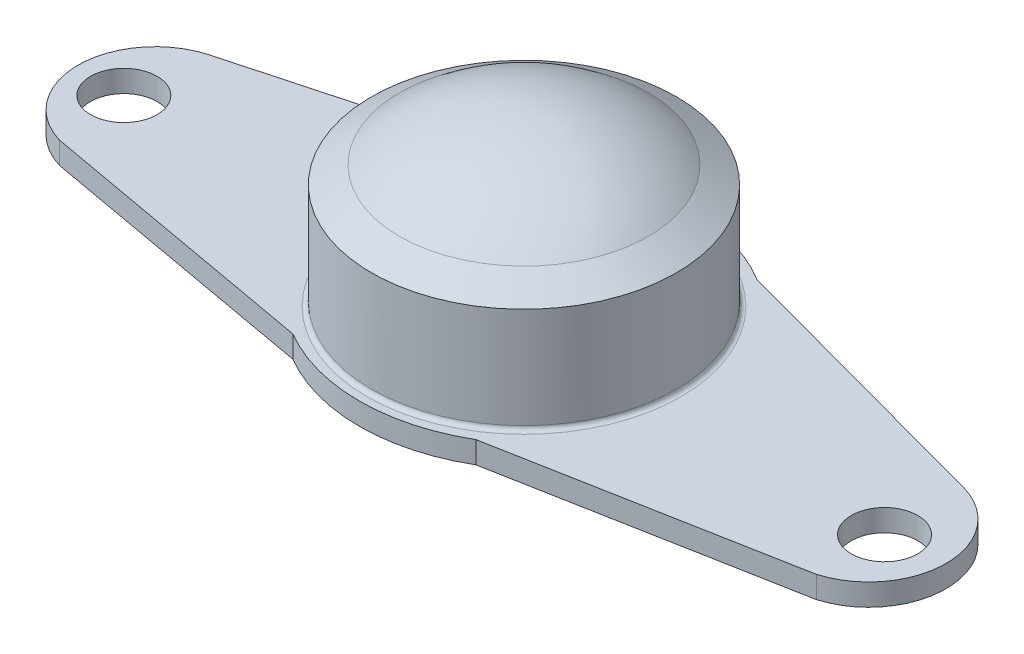
ISO-10303-21;
HEADER;
FILE_DESCRIPTION(('STEP AP214'),'2;1');
FILE_NAME('part.step','',(''),(''),'','','');
FILE_SCHEMA(('AUTOMOTIVE_DESIGN { 1 0 10303 214 1 1 1 1 }'));
ENDSEC;
DATA;
#1=APPLICATION_CONTEXT('core data for automotive mechanical design processes');
#2=APPLICATION_PROTOCOL_DEFINITION('international standard','automotive_design',2000,#1);
#3=PRODUCT_CONTEXT('',#1,'mechanical');
#4=PRODUCT('Part','Part','',(#3));
#5=PRODUCT_RELATED_PRODUCT_CATEGORY('part','',(#4));
#6=PRODUCT_DEFINITION_FORMATION('','',#4);
#7=PRODUCT_DEFINITION_CONTEXT('part definition',#1,'design');
#8=PRODUCT_DEFINITION('design','',#6,#7);
#9=PRODUCT_DEFINITION_SHAPE('','',#8);
#10=(LENGTH_UNIT() NAMED_UNIT(*) SI_UNIT(.MILLI.,.METRE.));
#11=(NAMED_UNIT(*) PLANE_ANGLE_UNIT() SI_UNIT($,.RADIAN.));
#12=(NAMED_UNIT(*) SI_UNIT($,.STERADIAN.) SOLID_ANGLE_UNIT());
#13=UNCERTAINTY_MEASURE_WITH_UNIT(LENGTH_MEASURE(1.E-05),#10,'distance_accuracy_value','');
#14=(GEOMETRIC_REPRESENTATION_CONTEXT(3) GLOBAL_UNCERTAINTY_ASSIGNED_CONTEXT((#13)) GLOBAL_UNIT_ASSIGNED_CONTEXT((#10,
#11,#12)) REPRESENTATION_CONTEXT('',''));
#15=CARTESIAN_POINT('',(0.,0.,0.));
#16=DIRECTION('',(0.,0.,1.));
#17=DIRECTION('',(1.,0.,0.));
#18=AXIS2_PLACEMENT_3D('',#15,#16,#17);
#19=CARTESIAN_POINT('',(0.,2.5,0.));
#20=DIRECTION('',(0.,1.,0.));
#21=DIRECTION('',(0.,0.,1.));
#22=AXIS2_PLACEMENT_3D('',#19,#20,#21);
#23=PLANE('',#22);
#24=CARTESIAN_POINT('',(-24.8478927236643,2.5,-20.4953921694321));
#25=DIRECTION('',(0.,1.,0.));
#26=DIRECTION('',(0.,0.,1.));
#27=AXIS2_PLACEMENT_3D('',#24,#25,#26);
#28=CIRCLE('',#27,17.9036643696297);
#29=CARTESIAN_POINT('',(-24.8478927236643,2.5,-2.59172779980247));
#30=VERTEX_POINT('',#29);
#31=EDGE_CURVE('E11',#30,#30,#28,.F.);
#32=ORIENTED_EDGE('',*,*,#31,.T.);
#33=EDGE_LOOP('',(#32));
#34=FACE_BOUND('',#33,.T.);
#35=CARTESIAN_POINT('',(-68.5099872093815,2.5,-18.4932623141663));
#36=DIRECTION('',(0.,1.,0.));
#37=DIRECTION('',(0.,0.,1.));
#38=AXIS2_PLACEMENT_3D('',#35,#36,#37);
#39=CIRCLE('',#38,3.79415254999999);
#40=CARTESIAN_POINT('',(-68.5099872093815,2.5,-14.6991097641663));
#41=VERTEX_POINT('',#40);
#42=EDGE_CURVE('E173',#41,#41,#39,.T.);
#43=ORIENTED_EDGE('',*,*,#42,.F.);
#44=EDGE_LOOP('',(#43));
#45=FACE_BOUND('',#44,.T.);
#46=CARTESIAN_POINT('',(18.3034860592528,2.5,-18.4932623141663));
#47=DIRECTION('',(0.,1.,0.));
#48=DIRECTION('',(0.,0.,1.));
#49=AXIS2_PLACEMENT_3D('',#46,#47,#48);
#50=CIRCLE('',#49,3.794155);
#51=CARTESIAN_POINT('',(18.3034860592528,2.5,-14.6991073141663));
#52=VERTEX_POINT('',#51);
#53=EDGE_CURVE('E170',#52,#52,#50,.T.);
#54=ORIENTED_EDGE('',*,*,#53,.F.);
#55=EDGE_LOOP('',(#54));
#56=FACE_BOUND('',#55,.T.);
#57=CARTESIAN_POINT('',(15.843912174543,2.5,-19.1437846710106));
#58=DIRECTION('',(0.,1.,0.));
#59=DIRECTION('',(0.,0.,1.));
#60=AXIS2_PLACEMENT_3D('',#57,#58,#59);
#61=CIRCLE('',#60,8.82234968708631);
#62=CARTESIAN_POINT('',(18.151883804096,2.5,-27.6588960007826));
#63=VERTEX_POINT('',#62);
#64=CARTESIAN_POINT('',(18.3297612293955,2.5,-10.6788919677497));
#65=VERTEX_POINT('',#64);
#66=EDGE_CURVE('E150',#63,#65,#61,.F.);
#67=ORIENTED_EDGE('',*,*,#66,.F.);
#68=DIRECTION('',(-0.965174996660574,0.,-0.261605095174504));
#69=VECTOR('',#68,1.);
#70=CARTESIAN_POINT('',(8.22598913222194,2.5,-30.3492522877896));
#71=LINE('',#70,#69);
#72=CARTESIAN_POINT('',(-14.156087825457,2.5,-36.4157846710106));
#73=VERTEX_POINT('',#72);
#74=EDGE_CURVE('E346',#63,#73,#71,.T.);
#75=ORIENTED_EDGE('',*,*,#74,.T.);
#76=CARTESIAN_POINT('',(-24.5138209557231,2.5,-19.5458172779228));
#77=DIRECTION('',(0.,1.,0.));
#78=DIRECTION('',(0.,0.,1.));
#79=AXIS2_PLACEMENT_3D('',#76,#77,#78);
#80=CIRCLE('',#79,19.7959196664782);
#81=CARTESIAN_POINT('',(-35.2979908669666,2.5,-36.1464231333454));
#82=VERTEX_POINT('',#81);
#83=EDGE_CURVE('E343',#73,#82,#80,.T.);
#84=ORIENTED_EDGE('',*,*,#83,.T.);
#85=DIRECTION('',(0.965174996660574,0.,-0.261605095174504));
#86=VECTOR('',#85,1.);
#87=CARTESIAN_POINT('',(-11.5424767236788,2.5,-42.5852177145104));
#88=LINE('',#87,#86);
#89=CARTESIAN_POINT('',(-67.6059624965196,2.5,-27.3895344631173));
#90=VERTEX_POINT('',#89);
#91=EDGE_CURVE('E345',#90,#82,#88,.T.);
#92=ORIENTED_EDGE('',*,*,#91,.F.);
#93=CARTESIAN_POINT('',(-65.2979908669666,2.5,-18.8744231333454));
#94=DIRECTION('',(0.,1.,0.));
#95=DIRECTION('',(0.,0.,1.));
#96=AXIS2_PLACEMENT_3D('',#93,#94,#95);
#97=CIRCLE('',#96,8.82234968708631);
#98=CARTESIAN_POINT('',(-67.7838399218191,2.5,-10.4095304300844));
#99=VERTEX_POINT('',#98);
#100=EDGE_CURVE('E111',#90,#99,#97,.T.);
#101=ORIENTED_EDGE('',*,*,#100,.T.);
#102=DIRECTION('',(0.984213782770149,0.,0.176983699264296));
#103=VECTOR('',#102,1.);
#104=CARTESIAN_POINT('',(-0.309974811409245,2.5,1.72378294141636));
#105=LINE('',#104,#103);
#106=CARTESIAN_POINT('',(-35.2979908669666,2.5,-4.56784660069628));
#107=VERTEX_POINT('',#106);
#108=EDGE_CURVE('E103',#99,#107,#105,.T.);
#109=ORIENTED_EDGE('',*,*,#108,.T.);
#110=CARTESIAN_POINT('',(-24.8604604325734,2.5,-22.3280311541789));
#111=DIRECTION('',(0.,1.,0.));
#112=DIRECTION('',(0.,0.,1.));
#113=AXIS2_PLACEMENT_3D('',#110,#111,#112);
#114=CIRCLE('',#113,20.6001504106802);
#115=CARTESIAN_POINT('',(-14.4229299981802,2.5,-4.56784660069629));
#116=VERTEX_POINT('',#115);
#117=EDGE_CURVE('E108',#116,#107,#114,.F.);
#118=ORIENTED_EDGE('',*,*,#117,.F.);
#119=DIRECTION('',(-0.983035352120809,0.,0.183416183802622));
#120=VECTOR('',#119,1.);
#121=CARTESIAN_POINT('',(-1.30881267021958,2.5,-7.0146979260785));
#122=LINE('',#121,#120);
#123=EDGE_CURVE('E126',#65,#116,#122,.T.);
#124=ORIENTED_EDGE('',*,*,#123,.F.);
#125=EDGE_LOOP('',(#67,#75,#84,#92,#101,#109,#118,#124));
#126=FACE_BOUND('',#125,.T.);
#127=ADVANCED_FACE('F34',(#34,#45,#56,#126),#23,.T.);
#128=CARTESIAN_POINT('',(15.843912174543,2.5,-19.1437846710106));
#129=DIRECTION('',(0.,-1.,0.));
#130=DIRECTION('',(0.,0.,-1.));
#131=AXIS2_PLACEMENT_3D('',#128,#129,#130);
#132=CYLINDRICAL_SURFACE('',#131,8.82234968708631);
#133=CARTESIAN_POINT('',(15.843912174543,0.,-19.1437846710106));
#134=DIRECTION('',(0.,1.,0.));
#135=DIRECTION('',(0.,0.,1.));
#136=AXIS2_PLACEMENT_3D('',#133,#134,#135);
#137=CIRCLE('',#136,8.82234968708631);
#138=CARTESIAN_POINT('',(18.151883804096,0.,-27.6588960007826));
#139=VERTEX_POINT('',#138);
#140=CARTESIAN_POINT('',(18.3297612293955,0.,-10.6788919677497));
#141=VERTEX_POINT('',#140);
#142=EDGE_CURVE('E131',#139,#141,#137,.F.);
#143=ORIENTED_EDGE('',*,*,#142,.F.);
#144=DIRECTION('',(0.,-1.,0.));
#145=VECTOR('',#144,1.);
#146=CARTESIAN_POINT('',(18.151883804096,2.5,-27.6588960007826));
#147=LINE('',#146,#145);
#148=EDGE_CURVE('E86',#63,#139,#147,.T.);
#149=ORIENTED_EDGE('',*,*,#148,.F.);
#150=ORIENTED_EDGE('',*,*,#66,.T.);
#151=DIRECTION('',(0.,-1.,0.));
#152=VECTOR('',#151,1.);
#153=CARTESIAN_POINT('',(18.3297612293955,2.5,-10.6788919677497));
#154=LINE('',#153,#152);
#155=EDGE_CURVE('E51',#65,#141,#154,.T.);
#156=ORIENTED_EDGE('',*,*,#155,.T.);
#157=EDGE_LOOP('',(#143,#149,#150,#156));
#158=FACE_BOUND('',#157,.T.);
#159=ADVANCED_FACE('F191',(#158),#132,.T.);
#160=CARTESIAN_POINT('',(8.22598913222194,2.5,-30.3492522877896));
#161=DIRECTION('',(-0.261605095174504,0.,0.965174996660574));
#162=DIRECTION('',(0.965174996660574,0.,0.261605095174504));
#163=AXIS2_PLACEMENT_3D('',#160,#161,#162);
#164=PLANE('',#163);
#165=DIRECTION('',(-0.965174996660574,0.,-0.261605095174504));
#166=VECTOR('',#165,1.);
#167=CARTESIAN_POINT('',(8.22598913222194,0.,-30.3492522877896));
#168=LINE('',#167,#166);
#169=CARTESIAN_POINT('',(-14.156087825457,0.,-36.4157846710106));
#170=VERTEX_POINT('',#169);
#171=EDGE_CURVE('E133',#139,#170,#168,.T.);
#172=ORIENTED_EDGE('',*,*,#171,.T.);
#173=DIRECTION('',(0.,-1.,0.));
#174=VECTOR('',#173,1.);
#175=CARTESIAN_POINT('',(-14.156087825457,2.5,-36.4157846710106));
#176=LINE('',#175,#174);
#177=EDGE_CURVE('E158',#73,#170,#176,.T.);
#178=ORIENTED_EDGE('',*,*,#177,.F.);
#179=ORIENTED_EDGE('',*,*,#74,.F.);
#180=ORIENTED_EDGE('',*,*,#148,.T.);
#181=EDGE_LOOP('',(#172,#178,#179,#180));
#182=FACE_BOUND('',#181,.T.);
#183=ADVANCED_FACE('F197',(#182),#164,.F.);
#184=CARTESIAN_POINT('',(-24.5138209557231,2.5,-19.5458172779228));
#185=DIRECTION('',(0.,-1.,0.));
#186=DIRECTION('',(0.,0.,-1.));
#187=AXIS2_PLACEMENT_3D('',#184,#185,#186);
#188=CYLINDRICAL_SURFACE('',#187,19.7959196664782);
#189=CARTESIAN_POINT('',(-24.5138209557231,0.,-19.5458172779228));
#190=DIRECTION('',(0.,1.,0.));
#191=DIRECTION('',(0.,0.,1.));
#192=AXIS2_PLACEMENT_3D('',#189,#190,#191);
#193=CIRCLE('',#192,19.7959196664782);
#194=CARTESIAN_POINT('',(-35.2979908669666,0.,-36.1464231333454));
#195=VERTEX_POINT('',#194);
#196=EDGE_CURVE('E136',#170,#195,#193,.T.);
#197=ORIENTED_EDGE('',*,*,#196,.T.);
#198=DIRECTION('',(0.,-1.,0.));
#199=VECTOR('',#198,1.);
#200=CARTESIAN_POINT('',(-35.2979908669666,2.5,-36.1464231333454));
#201=LINE('',#200,#199);
#202=EDGE_CURVE('E156',#82,#195,#201,.T.);
#203=ORIENTED_EDGE('',*,*,#202,.F.);
#204=ORIENTED_EDGE('',*,*,#83,.F.);
#205=ORIENTED_EDGE('',*,*,#177,.T.);
#206=EDGE_LOOP('',(#197,#203,#204,#205));
#207=FACE_BOUND('',#206,.T.);
#208=ADVANCED_FACE('F221',(#207),#188,.T.);
#209=CARTESIAN_POINT('',(-11.5424767236788,2.5,-42.5852177145104));
#210=DIRECTION('',(-0.261605095174504,0.,-0.965174996660574));
#211=DIRECTION('',(-0.965174996660574,0.,0.261605095174504));
#212=AXIS2_PLACEMENT_3D('',#209,#210,#211);
#213=PLANE('',#212);
#214=DIRECTION('',(0.965174996660574,0.,-0.261605095174504));
#215=VECTOR('',#214,1.);
#216=CARTESIAN_POINT('',(-11.5424767236788,0.,-42.5852177145104));
#217=LINE('',#216,#215);
#218=CARTESIAN_POINT('',(-67.6059624965196,0.,-27.3895344631173));
#219=VERTEX_POINT('',#218);
#220=EDGE_CURVE('E139',#219,#195,#217,.T.);
#221=ORIENTED_EDGE('',*,*,#220,.F.);
#222=DIRECTION('',(0.,-1.,0.));
#223=VECTOR('',#222,1.);
#224=CARTESIAN_POINT('',(-67.6059624965196,2.5,-27.3895344631173));
#225=LINE('',#224,#223);
#226=EDGE_CURVE('E154',#90,#219,#225,.T.);
#227=ORIENTED_EDGE('',*,*,#226,.F.);
#228=ORIENTED_EDGE('',*,*,#91,.T.);
#229=ORIENTED_EDGE('',*,*,#202,.T.);
#230=EDGE_LOOP('',(#221,#227,#228,#229));
#231=FACE_BOUND('',#230,.T.);
#232=ADVANCED_FACE('F217',(#231),#213,.T.);
#233=CARTESIAN_POINT('',(-65.2979908669666,2.5,-18.8744231333454));
#234=DIRECTION('',(0.,-1.,0.));
#235=DIRECTION('',(0.,0.,-1.));
#236=AXIS2_PLACEMENT_3D('',#233,#234,#235);
#237=CYLINDRICAL_SURFACE('',#236,8.82234968708631);
#238=CARTESIAN_POINT('',(-65.2979908669666,0.,-18.8744231333454));
#239=DIRECTION('',(0.,1.,0.));
#240=DIRECTION('',(0.,0.,1.));
#241=AXIS2_PLACEMENT_3D('',#238,#239,#240);
#242=CIRCLE('',#241,8.82234968708631);
#243=CARTESIAN_POINT('',(-67.7838399218191,0.,-10.4095304300844));
#244=VERTEX_POINT('',#243);
#245=EDGE_CURVE('E142',#219,#244,#242,.T.);
#246=ORIENTED_EDGE('',*,*,#245,.T.);
#247=DIRECTION('',(0.,-1.,0.));
#248=VECTOR('',#247,1.);
#249=CARTESIAN_POINT('',(-67.7838399218191,2.5,-10.4095304300844));
#250=LINE('',#249,#248);
#251=EDGE_CURVE('E123',#99,#244,#250,.T.);
#252=ORIENTED_EDGE('',*,*,#251,.F.);
#253=ORIENTED_EDGE('',*,*,#100,.F.);
#254=ORIENTED_EDGE('',*,*,#226,.T.);
#255=EDGE_LOOP('',(#246,#252,#253,#254));
#256=FACE_BOUND('',#255,.T.);
#257=ADVANCED_FACE('F214',(#256),#237,.T.);
#258=CARTESIAN_POINT('',(-0.309974811409245,2.5,1.72378294141636));
#259=DIRECTION('',(0.176983699264296,0.,-0.984213782770149));
#260=DIRECTION('',(-0.984213782770149,0.,-0.176983699264296));
#261=AXIS2_PLACEMENT_3D('',#258,#259,#260);
#262=PLANE('',#261);
#263=DIRECTION('',(0.984213782770149,0.,0.176983699264296));
#264=VECTOR('',#263,1.);
#265=CARTESIAN_POINT('',(-0.309974811409245,0.,1.72378294141636));
#266=LINE('',#265,#264);
#267=CARTESIAN_POINT('',(-35.2979908669666,0.,-4.56784660069628));
#268=VERTEX_POINT('',#267);
#269=EDGE_CURVE('E120',#244,#268,#266,.T.);
#270=ORIENTED_EDGE('',*,*,#269,.T.);
#271=DIRECTION('',(0.,-1.,0.));
#272=VECTOR('',#271,1.);
#273=CARTESIAN_POINT('',(-35.2979908669666,2.5,-4.56784660069628));
#274=LINE('',#273,#272);
#275=EDGE_CURVE('E117',#107,#268,#274,.T.);
#276=ORIENTED_EDGE('',*,*,#275,.F.);
#277=ORIENTED_EDGE('',*,*,#108,.F.);
#278=ORIENTED_EDGE('',*,*,#251,.T.);
#279=EDGE_LOOP('',(#270,#276,#277,#278));
#280=FACE_BOUND('',#279,.T.);
#281=ADVANCED_FACE('F118',(#280),#262,.F.);
#282=CARTESIAN_POINT('',(-24.8604604325734,2.5,-22.3280311541789));
#283=DIRECTION('',(0.,-1.,0.));
#284=DIRECTION('',(0.,0.,-1.));
#285=AXIS2_PLACEMENT_3D('',#282,#283,#284);
#286=CYLINDRICAL_SURFACE('',#285,20.6001504106802);
#287=CARTESIAN_POINT('',(-24.8604604325734,0.,-22.3280311541789));
#288=DIRECTION('',(0.,1.,0.));
#289=DIRECTION('',(0.,0.,1.));
#290=AXIS2_PLACEMENT_3D('',#287,#288,#289);
#291=CIRCLE('',#290,20.6001504106802);
#292=CARTESIAN_POINT('',(-14.4229299981802,0.,-4.56784660069629));
#293=VERTEX_POINT('',#292);
#294=EDGE_CURVE('E145',#293,#268,#291,.F.);
#295=ORIENTED_EDGE('',*,*,#294,.F.);
#296=DIRECTION('',(0.,-1.,0.));
#297=VECTOR('',#296,1.);
#298=CARTESIAN_POINT('',(-14.4229299981802,2.5,-4.56784660069629));
#299=LINE('',#298,#297);
#300=EDGE_CURVE('E77',#116,#293,#299,.T.);
#301=ORIENTED_EDGE('',*,*,#300,.F.);
#302=ORIENTED_EDGE('',*,*,#117,.T.);
#303=ORIENTED_EDGE('',*,*,#275,.T.);
#304=EDGE_LOOP('',(#295,#301,#302,#303));
#305=FACE_BOUND('',#304,.T.);
#306=ADVANCED_FACE('F125',(#305),#286,.T.);
#307=CARTESIAN_POINT('',(-1.30881267021958,2.5,-7.0146979260785));
#308=DIRECTION('',(0.183416183802622,0.,0.983035352120809));
#309=DIRECTION('',(0.983035352120809,0.,-0.183416183802622));
#310=AXIS2_PLACEMENT_3D('',#307,#308,#309);
#311=PLANE('',#310);
#312=DIRECTION('',(-0.983035352120809,0.,0.183416183802622));
#313=VECTOR('',#312,1.);
#314=CARTESIAN_POINT('',(-1.30881267021958,0.,-7.0146979260785));
#315=LINE('',#314,#313);
#316=EDGE_CURVE('E147',#141,#293,#315,.T.);
#317=ORIENTED_EDGE('',*,*,#316,.F.);
#318=ORIENTED_EDGE('',*,*,#155,.F.);
#319=ORIENTED_EDGE('',*,*,#123,.T.);
#320=ORIENTED_EDGE('',*,*,#300,.T.);
#321=EDGE_LOOP('',(#317,#318,#319,#320));
#322=FACE_BOUND('',#321,.T.);
#323=ADVANCED_FACE('F206',(#322),#311,.T.);
#324=CARTESIAN_POINT('',(0.,0.,0.));
#325=DIRECTION('',(0.,1.,0.));
#326=DIRECTION('',(0.,0.,1.));
#327=AXIS2_PLACEMENT_3D('',#324,#325,#326);
#328=PLANE('',#327);
#329=CARTESIAN_POINT('',(-68.5099872093815,0.,-18.4932623141663));
#330=DIRECTION('',(0.,1.,0.));
#331=DIRECTION('',(0.,0.,1.));
#332=AXIS2_PLACEMENT_3D('',#329,#330,#331);
#333=CIRCLE('',#332,3.79415254999999);
#334=CARTESIAN_POINT('',(-68.5099872093815,0.,-14.6991097641663));
#335=VERTEX_POINT('',#334);
#336=EDGE_CURVE('E171',#335,#335,#333,.T.);
#337=ORIENTED_EDGE('',*,*,#336,.T.);
#338=EDGE_LOOP('',(#337));
#339=FACE_BOUND('',#338,.T.);
#340=CARTESIAN_POINT('',(18.3034860592528,0.,-18.4932623141663));
#341=DIRECTION('',(0.,1.,0.));
#342=DIRECTION('',(0.,0.,1.));
#343=AXIS2_PLACEMENT_3D('',#340,#341,#342);
#344=CIRCLE('',#343,3.794155);
#345=CARTESIAN_POINT('',(18.3034860592528,0.,-14.6991073141663));
#346=VERTEX_POINT('',#345);
#347=EDGE_CURVE('E134',#346,#346,#344,.T.);
#348=ORIENTED_EDGE('',*,*,#347,.T.);
#349=EDGE_LOOP('',(#348));
#350=FACE_BOUND('',#349,.T.);
#351=ORIENTED_EDGE('',*,*,#142,.T.);
#352=ORIENTED_EDGE('',*,*,#316,.T.);
#353=ORIENTED_EDGE('',*,*,#294,.T.);
#354=ORIENTED_EDGE('',*,*,#269,.F.);
#355=ORIENTED_EDGE('',*,*,#245,.F.);
#356=ORIENTED_EDGE('',*,*,#220,.T.);
#357=ORIENTED_EDGE('',*,*,#196,.F.);
#358=ORIENTED_EDGE('',*,*,#171,.F.);
#359=EDGE_LOOP('',(#351,#352,#353,#354,#355,#356,#357,#358));
#360=FACE_BOUND('',#359,.T.);
#361=ADVANCED_FACE('F203',(#339,#350,#360),#328,.F.);
#362=CARTESIAN_POINT('',(-24.8478927236643,16.5,-20.4953921694321));
#363=DIRECTION('',(0.,-1.,0.));
#364=DIRECTION('',(0.,0.,-1.));
#365=AXIS2_PLACEMENT_3D('',#362,#363,#364);
#366=CYLINDRICAL_SURFACE('',#365,17.4036643696297);
#367=CARTESIAN_POINT('',(-24.8478927236643,3.,-20.4953921694321));
#368=DIRECTION('',(0.,1.,0.));
#369=DIRECTION('',(0.,0.,1.));
#370=AXIS2_PLACEMENT_3D('',#367,#368,#369);
#371=CIRCLE('',#370,17.4036643696297);
#372=CARTESIAN_POINT('',(-24.8478927236643,3.,-37.8990565390618));
#373=VERTEX_POINT('',#372);
#374=EDGE_CURVE('E43',#373,#373,#371,.T.);
#375=CARTESIAN_POINT('',(-24.8478927236643,14.5,-20.4953921694321));
#376=DIRECTION('',(0.,1.,0.));
#377=DIRECTION('',(0.,0.,1.));
#378=AXIS2_PLACEMENT_3D('',#375,#376,#377);
#379=CIRCLE('',#378,17.4036643696297);
#380=CARTESIAN_POINT('',(-24.8478927236643,14.5,-37.8990565390618));
#381=VERTEX_POINT('',#380);
#382=EDGE_CURVE('E163',#381,#381,#379,.F.);
#383=CARTESIAN_POINT('',(-24.8478927236643,3.,-37.8990565390618));
#384=CARTESIAN_POINT('',(-24.8478927236643,3.11979166666666,-37.8990565390618));
#385=CARTESIAN_POINT('',(-24.8478927236643,3.23958333333333,-37.8990565390618));
#386=CARTESIAN_POINT('',(-24.8478927236643,3.47916666666667,-37.8990565390618));
#387=CARTESIAN_POINT('',(-24.8478927236643,3.59895833333333,-37.8990565390618));
#388=CARTESIAN_POINT('',(-24.8478927236643,3.83854166666667,-37.8990565390618));
#389=CARTESIAN_POINT('',(-24.8478927236643,3.95833333333333,-37.8990565390618));
#390=CARTESIAN_POINT('',(-24.8478927236643,4.19791666666667,-37.8990565390618));
#391=CARTESIAN_POINT('',(-24.8478927236643,4.31770833333334,-37.8990565390618));
#392=CARTESIAN_POINT('',(-24.8478927236643,4.55729166666667,-37.8990565390618));
#393=CARTESIAN_POINT('',(-24.8478927236643,4.67708333333334,-37.8990565390618));
#394=CARTESIAN_POINT('',(-24.8478927236643,4.91666666666667,-37.8990565390618));
#395=CARTESIAN_POINT('',(-24.8478927236643,5.03645833333334,-37.8990565390618));
#396=CARTESIAN_POINT('',(-24.8478927236643,5.27604166666667,-37.8990565390618));
#397=CARTESIAN_POINT('',(-24.8478927236643,5.39583333333334,-37.8990565390618));
#398=CARTESIAN_POINT('',(-24.8478927236643,5.63541666666667,-37.8990565390618));
#399=CARTESIAN_POINT('',(-24.8478927236643,5.75520833333334,-37.8990565390618));
#400=CARTESIAN_POINT('',(-24.8478927236643,5.99479166666667,-37.8990565390618));
#401=CARTESIAN_POINT('',(-24.8478927236643,6.11458333333334,-37.8990565390618));
#402=CARTESIAN_POINT('',(-24.8478927236643,6.35416666666668,-37.8990565390618));
#403=CARTESIAN_POINT('',(-24.8478927236643,6.47395833333334,-37.8990565390618));
#404=CARTESIAN_POINT('',(-24.8478927236643,6.71354166666668,-37.8990565390618));
#405=CARTESIAN_POINT('',(-24.8478927236643,6.83333333333334,-37.8990565390618));
#406=CARTESIAN_POINT('',(-24.8478927236643,7.07291666666668,-37.8990565390618));
#407=CARTESIAN_POINT('',(-24.8478927236643,7.19270833333335,-37.8990565390618));
#408=CARTESIAN_POINT('',(-24.8478927236643,7.43229166666668,-37.8990565390618));
#409=CARTESIAN_POINT('',(-24.8478927236643,7.55208333333335,-37.8990565390618));
#410=CARTESIAN_POINT('',(-24.8478927236643,7.79166666666668,-37.8990565390618));
#411=CARTESIAN_POINT('',(-24.8478927236643,7.91145833333335,-37.8990565390618));
#412=CARTESIAN_POINT('',(-24.8478927236643,8.15104166666668,-37.8990565390618));
#413=CARTESIAN_POINT('',(-24.8478927236643,8.27083333333335,-37.8990565390618));
#414=CARTESIAN_POINT('',(-24.8478927236643,8.51041666666668,-37.8990565390618));
#415=CARTESIAN_POINT('',(-24.8478927236643,8.63020833333335,-37.8990565390618));
#416=CARTESIAN_POINT('',(-24.8478927236643,8.86979166666668,-37.8990565390618));
#417=CARTESIAN_POINT('',(-24.8478927236643,8.98958333333335,-37.8990565390618));
#418=CARTESIAN_POINT('',(-24.8478927236643,9.22916666666668,-37.8990565390618));
#419=CARTESIAN_POINT('',(-24.8478927236643,9.34895833333335,-37.8990565390618));
#420=CARTESIAN_POINT('',(-24.8478927236643,9.58854166666669,-37.8990565390618));
#421=CARTESIAN_POINT('',(-24.8478927236643,9.70833333333335,-37.8990565390618));
#422=CARTESIAN_POINT('',(-24.8478927236643,9.94791666666669,-37.8990565390618));
#423=CARTESIAN_POINT('',(-24.8478927236643,10.0677083333334,-37.8990565390618));
#424=CARTESIAN_POINT('',(-24.8478927236643,10.3072916666667,-37.8990565390618));
#425=CARTESIAN_POINT('',(-24.8478927236643,10.4270833333334,-37.8990565390618));
#426=CARTESIAN_POINT('',(-24.8478927236643,10.6666666666667,-37.8990565390618));
#427=CARTESIAN_POINT('',(-24.8478927236643,10.7864583333334,-37.8990565390618));
#428=CARTESIAN_POINT('',(-24.8478927236643,11.0260416666667,-37.8990565390618));
#429=CARTESIAN_POINT('',(-24.8478927236643,11.1458333333334,-37.8990565390618));
#430=CARTESIAN_POINT('',(-24.8478927236643,11.3854166666667,-37.8990565390618));
#431=CARTESIAN_POINT('',(-24.8478927236643,11.5052083333334,-37.8990565390618));
#432=CARTESIAN_POINT('',(-24.8478927236643,11.7447916666667,-37.8990565390618));
#433=CARTESIAN_POINT('',(-24.8478927236643,11.8645833333334,-37.8990565390618));
#434=CARTESIAN_POINT('',(-24.8478927236643,12.1041666666667,-37.8990565390618));
#435=CARTESIAN_POINT('',(-24.8478927236643,12.2239583333334,-37.8990565390618));
#436=CARTESIAN_POINT('',(-24.8478927236643,12.4635416666667,-37.8990565390618));
#437=CARTESIAN_POINT('',(-24.8478927236643,12.5833333333334,-37.8990565390618));
#438=CARTESIAN_POINT('',(-24.8478927236643,12.8229166666667,-37.8990565390618));
#439=CARTESIAN_POINT('',(-24.8478927236643,12.9427083333334,-37.8990565390618));
#440=CARTESIAN_POINT('',(-24.8478927236643,13.1822916666667,-37.8990565390618));
#441=CARTESIAN_POINT('',(-24.8478927236643,13.3020833333334,-37.8990565390618));
#442=CARTESIAN_POINT('',(-24.8478927236643,13.5416666666667,-37.8990565390618));
#443=CARTESIAN_POINT('',(-24.8478927236643,13.6614583333334,-37.8990565390618));
#444=CARTESIAN_POINT('',(-24.8478927236643,13.9010416666667,-37.8990565390618));
#445=CARTESIAN_POINT('',(-24.8478927236643,14.0208333333334,-37.8990565390618));
#446=CARTESIAN_POINT('',(-24.8478927236643,14.2604166666667,-37.8990565390618));
#447=CARTESIAN_POINT('',(-24.8478927236643,14.3802083333334,-37.8990565390618));
#448=CARTESIAN_POINT('',(-24.8478927236643,14.5,-37.8990565390618));
#449=B_SPLINE_CURVE_WITH_KNOTS('',3,(#383,#384,#385,#386,#387,#388,#389,#390,#391,#392,#393,
#394,#395,#396,#397,#398,#399,#400,#401,#402,#403,#404,#405,#406,#407,#408,#409,#410,#411,#412,
#413,#414,#415,#416,#417,#418,#419,#420,#421,#422,#423,#424,#425,#426,#427,#428,#429,#430,#431,
#432,#433,#434,#435,#436,#437,#438,#439,#440,#441,#442,#443,#444,#445,#446,#447,#448),
.UNSPECIFIED.,.F.,.F.,(4,2,2,2,2,2,2,2,2,2,2,2,2,2,2,2,2,2,2,2,2,2,2,2,2,2,2,2,2,2,2,2,4),(0.,
0.359375000000002,0.718750000000002,1.078125,1.4375,1.79687500000001,2.15625000000001,
2.51562500000001,2.87500000000001,3.23437500000001,3.59375000000001,3.95312500000001,
4.31250000000001,4.67187500000002,5.03125000000002,5.39062500000002,5.75000000000002,
6.10937500000002,6.46875000000002,6.82812500000002,7.18750000000002,7.54687500000002,
7.90625000000003,8.26562500000003,8.62500000000003,8.98437500000003,9.34375000000003,
9.70312500000003,10.0625,10.421875,10.78125,11.140625,11.5),.UNSPECIFIED.);
#450=EDGE_CURVE('BSEAM177',#373,#381,#449,.T.);
#451=ORIENTED_EDGE('',*,*,#374,.T.);
#452=ORIENTED_EDGE('',*,*,#382,.T.);
#453=ORIENTED_EDGE('',*,*,#450,.T.);
#454=ORIENTED_EDGE('',*,*,#450,.F.);
#455=EDGE_LOOP('',(#451,#453,#452,#454));
#456=FACE_BOUND('',#455,.T.);
#457=ADVANCED_FACE('F177',(#456),#366,.T.);
#458=CARTESIAN_POINT('',(-24.8478927236643,-0.814830297228807,-20.4953921694321));
#459=DIRECTION('',(0.,0.,1.));
#460=DIRECTION('',(1.,0.,0.));
#461=AXIS2_PLACEMENT_3D('',#458,#459,#460);
#462=SPHERICAL_SURFACE('',#461,22.3948302972288);
#463=CARTESIAN_POINT('',(-24.8478927236643,-0.814830297228807,-20.4953921694321));
#464=DIRECTION('',(0.,1.,0.));
#465=DIRECTION('',(0.,0.,1.));
#466=AXIS2_PLACEMENT_3D('',#463,#464,#465);
#467=SPHERICAL_SURFACE('',#466,22.3948302972288);
#468=CARTESIAN_POINT('',(-24.8478927236643,16.5,-20.4953921694321));
#469=DIRECTION('',(0.,1.,0.));
#470=DIRECTION('',(0.,0.,1.));
#471=AXIS2_PLACEMENT_3D('',#468,#469,#470);
#472=CIRCLE('',#471,14.2029953115477);
#473=CARTESIAN_POINT('',(-24.8478927236643,16.5,-6.29239685788449));
#474=VERTEX_POINT('',#473);
#475=EDGE_CURVE('E162',#474,#474,#472,.T.);
#476=ORIENTED_EDGE('',*,*,#475,.T.);
#477=EDGE_LOOP('',(#476));
#478=FACE_BOUND('',#477,.T.);
#479=ADVANCED_FACE('F231',(#478),#467,.T.);
#480=CARTESIAN_POINT('',(-24.8478927236643,16.5,-20.4953921694321));
#481=DIRECTION('',(0.,-1.,0.));
#482=DIRECTION('',(0.,0.,-1.));
#483=AXIS2_PLACEMENT_3D('',#480,#481,#482);
#484=CONICAL_SURFACE('',#483,14.2029953115477,1.01229096615671);
#485=ORIENTED_EDGE('',*,*,#382,.F.);
#486=EDGE_LOOP('',(#485));
#487=FACE_BOUND('',#486,.T.);
#488=ORIENTED_EDGE('',*,*,#475,.F.);
#489=EDGE_LOOP('',(#488));
#490=FACE_BOUND('',#489,.T.);
#491=ADVANCED_FACE('F229',(#487,#490),#484,.T.);
#492=CARTESIAN_POINT('',(18.3034860592528,-19.725,-18.4932623141663));
#493=DIRECTION('',(0.,1.,0.));
#494=DIRECTION('',(0.,0.,1.));
#495=AXIS2_PLACEMENT_3D('',#492,#493,#494);
#496=CYLINDRICAL_SURFACE('',#495,3.794155);
#497=ORIENTED_EDGE('',*,*,#53,.T.);
#498=EDGE_LOOP('',(#497));
#499=FACE_BOUND('',#498,.T.);
#500=ORIENTED_EDGE('',*,*,#347,.F.);
#501=EDGE_LOOP('',(#500));
#502=FACE_BOUND('',#501,.T.);
#503=ADVANCED_FACE('F186',(#499,#502),#496,.F.);
#504=CARTESIAN_POINT('',(-68.5099872093815,-19.725,-18.4932623141663));
#505=DIRECTION('',(0.,1.,0.));
#506=DIRECTION('',(0.,0.,1.));
#507=AXIS2_PLACEMENT_3D('',#504,#505,#506);
#508=CYLINDRICAL_SURFACE('',#507,3.79415254999999);
#509=ORIENTED_EDGE('',*,*,#42,.T.);
#510=EDGE_LOOP('',(#509));
#511=FACE_BOUND('',#510,.T.);
#512=ORIENTED_EDGE('',*,*,#336,.F.);
#513=EDGE_LOOP('',(#512));
#514=FACE_BOUND('',#513,.T.);
#515=ADVANCED_FACE('F181',(#511,#514),#508,.F.);
#516=CARTESIAN_POINT('',(-24.8478927236643,3.,-20.4953921694321));
#517=DIRECTION('',(0.,1.,0.));
#518=DIRECTION('',(0.,0.,1.));
#519=AXIS2_PLACEMENT_3D('',#516,#517,#518);
#520=TOROIDAL_SURFACE('',#519,17.9036643696297,0.5);
#521=ORIENTED_EDGE('',*,*,#31,.F.);
#522=EDGE_LOOP('',(#521));
#523=FACE_BOUND('',#522,.T.);
#524=ORIENTED_EDGE('',*,*,#374,.F.);
#525=EDGE_LOOP('',(#524));
#526=FACE_BOUND('',#525,.T.);
#527=ADVANCED_FACE('F36',(#523,#526),#520,.F.);
#528=CLOSED_SHELL('',(#127,#159,#183,#208,#232,#257,#281,#306,#323,#361,#457,#479,#491,#503,
#515,#527));
#529=MANIFOLD_SOLID_BREP('B2',#528);
#530=ADVANCED_BREP_SHAPE_REPRESENTATION('',(#18,#529),#14);
#531=SHAPE_DEFINITION_REPRESENTATION(#9,#530);
ENDSEC;
END-ISO-10303-21;
